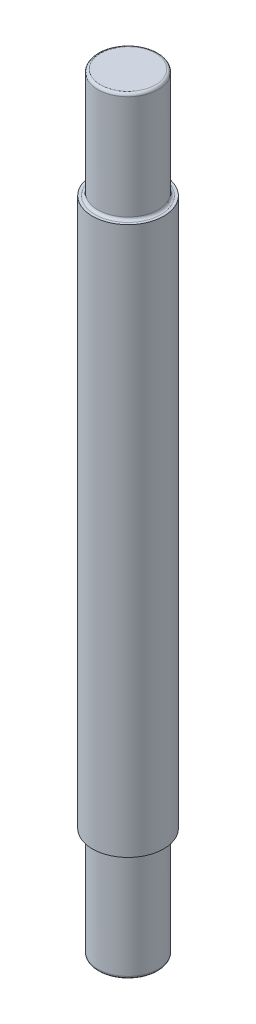
ISO-10303-21;
HEADER;
FILE_DESCRIPTION(('STEP AP214'),'2;1');
FILE_NAME('part.step','',(''),(''),'','','');
FILE_SCHEMA(('AUTOMOTIVE_DESIGN { 1 0 10303 214 1 1 1 1 }'));
ENDSEC;
DATA;
#1=APPLICATION_CONTEXT('core data for automotive mechanical design processes');
#2=APPLICATION_PROTOCOL_DEFINITION('international standard','automotive_design',2000,#1);
#3=PRODUCT_CONTEXT('',#1,'mechanical');
#4=PRODUCT('Part','Part','',(#3));
#5=PRODUCT_RELATED_PRODUCT_CATEGORY('part','',(#4));
#6=PRODUCT_DEFINITION_FORMATION('','',#4);
#7=PRODUCT_DEFINITION_CONTEXT('part definition',#1,'design');
#8=PRODUCT_DEFINITION('design','',#6,#7);
#9=PRODUCT_DEFINITION_SHAPE('','',#8);
#10=(LENGTH_UNIT() NAMED_UNIT(*) SI_UNIT(.MILLI.,.METRE.));
#11=(NAMED_UNIT(*) PLANE_ANGLE_UNIT() SI_UNIT($,.RADIAN.));
#12=(NAMED_UNIT(*) SI_UNIT($,.STERADIAN.) SOLID_ANGLE_UNIT());
#13=UNCERTAINTY_MEASURE_WITH_UNIT(LENGTH_MEASURE(1.E-05),#10,'distance_accuracy_value','');
#14=(GEOMETRIC_REPRESENTATION_CONTEXT(3) GLOBAL_UNCERTAINTY_ASSIGNED_CONTEXT((#13)) GLOBAL_UNIT_ASSIGNED_CONTEXT((#10,
#11,#12)) REPRESENTATION_CONTEXT('',''));
#15=CARTESIAN_POINT('',(0.,0.,0.));
#16=DIRECTION('',(0.,0.,1.));
#17=DIRECTION('',(1.,0.,0.));
#18=AXIS2_PLACEMENT_3D('',#15,#16,#17);
#19=CARTESIAN_POINT('',(0.,0.,0.));
#20=DIRECTION('',(0.,1.,0.));
#21=DIRECTION('',(-1.,0.,0.));
#22=AXIS2_PLACEMENT_3D('',#19,#20,#21);
#23=CYLINDRICAL_SURFACE('',#22,6.5);
#24=CARTESIAN_POINT('',(0.,100.,0.));
#25=DIRECTION('',(0.,1.,0.));
#26=DIRECTION('',(-1.,0.,0.));
#27=AXIS2_PLACEMENT_3D('',#24,#25,#26);
#28=CIRCLE('',#27,6.5);
#29=CARTESIAN_POINT('',(6.5,100.,0.));
#30=VERTEX_POINT('',#29);
#31=EDGE_CURVE('E20',#30,#30,#28,.T.);
#32=ORIENTED_EDGE('',*,*,#31,.F.);
#33=DIRECTION('',(0.,-1.,0.));
#34=VECTOR('',#33,1.);
#35=CARTESIAN_POINT('',(6.5,0.,0.));
#36=LINE('',#35,#34);
#37=CARTESIAN_POINT('',(6.5,0.,0.));
#38=VERTEX_POINT('',#37);
#39=EDGE_CURVE('E11',#30,#38,#36,.T.);
#40=ORIENTED_EDGE('',*,*,#39,.T.);
#41=CARTESIAN_POINT('',(0.,0.,0.));
#42=DIRECTION('',(0.,1.,0.));
#43=DIRECTION('',(-1.,0.,0.));
#44=AXIS2_PLACEMENT_3D('',#41,#42,#43);
#45=CIRCLE('',#44,6.5);
#46=EDGE_CURVE('E27',#38,#38,#45,.T.);
#47=ORIENTED_EDGE('',*,*,#46,.T.);
#48=ORIENTED_EDGE('',*,*,#39,.F.);
#49=EDGE_LOOP('',(#32,#40,#47,#48));
#50=FACE_BOUND('',#49,.T.);
#51=ADVANCED_FACE('F16',(#50),#23,.T.);
#52=CARTESIAN_POINT('',(0.,0.,0.));
#53=DIRECTION('',(0.,1.,0.));
#54=DIRECTION('',(1.,0.,0.));
#55=AXIS2_PLACEMENT_3D('',#52,#53,#54);
#56=PLANE('',#55);
#57=CARTESIAN_POINT('',(0.,0.,0.));
#58=DIRECTION('',(0.,-1.,0.));
#59=DIRECTION('',(-1.,0.,0.));
#60=AXIS2_PLACEMENT_3D('',#57,#58,#59);
#61=CIRCLE('',#60,6.);
#62=CARTESIAN_POINT('',(0.,0.,-6.));
#63=VERTEX_POINT('',#62);
#64=EDGE_CURVE('E106',#63,#63,#61,.T.);
#65=ORIENTED_EDGE('',*,*,#64,.F.);
#66=EDGE_LOOP('',(#65));
#67=FACE_BOUND('',#66,.T.);
#68=ORIENTED_EDGE('',*,*,#46,.F.);
#69=EDGE_LOOP('',(#68));
#70=FACE_BOUND('',#69,.T.);
#71=ADVANCED_FACE('F184',(#67,#70),#56,.F.);
#72=CARTESIAN_POINT('',(0.,-0.5,0.));
#73=DIRECTION('',(0.,1.,0.));
#74=DIRECTION('',(0.,0.,1.));
#75=AXIS2_PLACEMENT_3D('',#72,#73,#74);
#76=TOROIDAL_SURFACE('',#75,6.,0.5);
#77=CARTESIAN_POINT('',(0.,-0.5,0.));
#78=DIRECTION('',(0.,1.,0.));
#79=DIRECTION('',(-1.,0.,0.));
#80=AXIS2_PLACEMENT_3D('',#77,#78,#79);
#81=CIRCLE('',#80,5.5);
#82=CARTESIAN_POINT('',(-5.5,-0.5,0.));
#83=VERTEX_POINT('',#82);
#84=CARTESIAN_POINT('',(0.,-0.5,-5.5));
#85=VERTEX_POINT('',#84);
#86=EDGE_CURVE('E130',#83,#85,#81,.T.);
#87=ORIENTED_EDGE('',*,*,#86,.T.);
#88=CARTESIAN_POINT('',(0.,-0.5,-6.));
#89=DIRECTION('',(-1.,0.,0.));
#90=DIRECTION('',(0.,0.,-1.));
#91=AXIS2_PLACEMENT_3D('',#88,#89,#90);
#92=CIRCLE('',#91,0.5);
#93=EDGE_CURVE('E109',#85,#63,#92,.T.);
#94=ORIENTED_EDGE('',*,*,#93,.T.);
#95=ORIENTED_EDGE('',*,*,#64,.T.);
#96=ORIENTED_EDGE('',*,*,#93,.F.);
#97=CARTESIAN_POINT('',(0.,-0.5,0.));
#98=DIRECTION('',(0.,1.,0.));
#99=DIRECTION('',(-1.,0.,0.));
#100=AXIS2_PLACEMENT_3D('',#97,#98,#99);
#101=CIRCLE('',#100,5.5);
#102=EDGE_CURVE('E142',#85,#83,#101,.T.);
#103=ORIENTED_EDGE('',*,*,#102,.T.);
#104=EDGE_LOOP('',(#87,#94,#95,#96,#103));
#105=FACE_BOUND('',#104,.T.);
#106=ADVANCED_FACE('F165',(#105),#76,.F.);
#107=CARTESIAN_POINT('',(0.,-20.,0.));
#108=DIRECTION('',(0.,-1.,0.));
#109=DIRECTION('',(0.,0.,-1.));
#110=AXIS2_PLACEMENT_3D('',#107,#108,#109);
#111=PLANE('',#110);
#112=CARTESIAN_POINT('',(0.,-20.,0.));
#113=DIRECTION('',(0.,1.,0.));
#114=DIRECTION('',(-1.,0.,0.));
#115=AXIS2_PLACEMENT_3D('',#112,#113,#114);
#116=CIRCLE('',#115,5.);
#117=CARTESIAN_POINT('',(0.,-20.,5.));
#118=VERTEX_POINT('',#117);
#119=EDGE_CURVE('E100',#118,#118,#116,.T.);
#120=ORIENTED_EDGE('',*,*,#119,.F.);
#121=EDGE_LOOP('',(#120));
#122=FACE_BOUND('',#121,.T.);
#123=ADVANCED_FACE('F174',(#122),#111,.T.);
#124=CARTESIAN_POINT('',(0.,0.,0.));
#125=DIRECTION('',(0.,-1.,0.));
#126=DIRECTION('',(1.,0.,0.));
#127=AXIS2_PLACEMENT_3D('',#124,#125,#126);
#128=CYLINDRICAL_SURFACE('',#127,5.5);
#129=CARTESIAN_POINT('',(0.,-19.5,0.));
#130=DIRECTION('',(0.,-1.,0.));
#131=DIRECTION('',(-1.,0.,0.));
#132=AXIS2_PLACEMENT_3D('',#129,#130,#131);
#133=CIRCLE('',#132,5.5);
#134=CARTESIAN_POINT('',(-5.5,-19.5,0.));
#135=VERTEX_POINT('',#134);
#136=CARTESIAN_POINT('',(0.,-19.5,5.5));
#137=VERTEX_POINT('',#136);
#138=EDGE_CURVE('E119',#135,#137,#133,.T.);
#139=ORIENTED_EDGE('',*,*,#138,.F.);
#140=DIRECTION('',(0.,1.,0.));
#141=VECTOR('',#140,1.);
#142=CARTESIAN_POINT('',(-5.5,0.,0.));
#143=LINE('',#142,#141);
#144=EDGE_CURVE('E138',#135,#83,#143,.T.);
#145=ORIENTED_EDGE('',*,*,#144,.T.);
#146=ORIENTED_EDGE('',*,*,#102,.F.);
#147=ORIENTED_EDGE('',*,*,#86,.F.);
#148=ORIENTED_EDGE('',*,*,#144,.F.);
#149=CARTESIAN_POINT('',(0.,-19.5,0.));
#150=DIRECTION('',(0.,-1.,0.));
#151=DIRECTION('',(-1.,0.,0.));
#152=AXIS2_PLACEMENT_3D('',#149,#150,#151);
#153=CIRCLE('',#152,5.5);
#154=EDGE_CURVE('E115',#137,#135,#153,.T.);
#155=ORIENTED_EDGE('',*,*,#154,.F.);
#156=EDGE_LOOP('',(#139,#145,#146,#147,#148,#155));
#157=FACE_BOUND('',#156,.T.);
#158=ADVANCED_FACE('F168',(#157),#128,.T.);
#159=CARTESIAN_POINT('',(0.,-19.5,0.));
#160=DIRECTION('',(0.,-1.,0.));
#161=DIRECTION('',(0.,0.,-1.));
#162=AXIS2_PLACEMENT_3D('',#159,#160,#161);
#163=TOROIDAL_SURFACE('',#162,5.,0.5);
#164=ORIENTED_EDGE('',*,*,#119,.T.);
#165=CARTESIAN_POINT('',(0.,-19.5,5.));
#166=DIRECTION('',(-1.,0.,0.));
#167=DIRECTION('',(0.,0.,1.));
#168=AXIS2_PLACEMENT_3D('',#165,#166,#167);
#169=CIRCLE('',#168,0.5);
#170=EDGE_CURVE('E120',#118,#137,#169,.T.);
#171=ORIENTED_EDGE('',*,*,#170,.T.);
#172=ORIENTED_EDGE('',*,*,#154,.T.);
#173=ORIENTED_EDGE('',*,*,#138,.T.);
#174=ORIENTED_EDGE('',*,*,#170,.F.);
#175=EDGE_LOOP('',(#164,#171,#172,#173,#174));
#176=FACE_BOUND('',#175,.T.);
#177=ADVANCED_FACE('F171',(#176),#163,.T.);
#178=CARTESIAN_POINT('',(0.,100.,0.));
#179=DIRECTION('',(0.,1.,0.));
#180=DIRECTION('',(1.,0.,0.));
#181=AXIS2_PLACEMENT_3D('',#178,#179,#180);
#182=PLANE('',#181);
#183=CARTESIAN_POINT('',(0.,100.,0.));
#184=DIRECTION('',(0.,1.,0.));
#185=DIRECTION('',(-1.,0.,0.));
#186=AXIS2_PLACEMENT_3D('',#183,#184,#185);
#187=CIRCLE('',#186,6.);
#188=CARTESIAN_POINT('',(0.,100.,6.));
#189=VERTEX_POINT('',#188);
#190=EDGE_CURVE('E86',#189,#189,#187,.T.);
#191=ORIENTED_EDGE('',*,*,#190,.F.);
#192=EDGE_LOOP('',(#191));
#193=FACE_BOUND('',#192,.T.);
#194=ORIENTED_EDGE('',*,*,#31,.T.);
#195=EDGE_LOOP('',(#194));
#196=FACE_BOUND('',#195,.T.);
#197=ADVANCED_FACE('F196',(#193,#196),#182,.T.);
#198=CARTESIAN_POINT('',(0.,100.5,0.));
#199=DIRECTION('',(0.,-1.,0.));
#200=DIRECTION('',(0.,0.,-1.));
#201=AXIS2_PLACEMENT_3D('',#198,#199,#200);
#202=TOROIDAL_SURFACE('',#201,6.,0.5);
#203=CARTESIAN_POINT('',(0.,100.5,0.));
#204=DIRECTION('',(0.,-1.,0.));
#205=DIRECTION('',(-1.,0.,0.));
#206=AXIS2_PLACEMENT_3D('',#203,#204,#205);
#207=CIRCLE('',#206,5.5);
#208=CARTESIAN_POINT('',(-5.5,100.5,0.));
#209=VERTEX_POINT('',#208);
#210=CARTESIAN_POINT('',(0.,100.5,5.5));
#211=VERTEX_POINT('',#210);
#212=EDGE_CURVE('E101',#209,#211,#207,.T.);
#213=ORIENTED_EDGE('',*,*,#212,.T.);
#214=CARTESIAN_POINT('',(0.,100.5,6.));
#215=DIRECTION('',(-1.,0.,0.));
#216=DIRECTION('',(0.,0.,1.));
#217=AXIS2_PLACEMENT_3D('',#214,#215,#216);
#218=CIRCLE('',#217,0.5);
#219=EDGE_CURVE('E90',#211,#189,#218,.T.);
#220=ORIENTED_EDGE('',*,*,#219,.T.);
#221=ORIENTED_EDGE('',*,*,#190,.T.);
#222=ORIENTED_EDGE('',*,*,#219,.F.);
#223=CARTESIAN_POINT('',(0.,100.5,0.));
#224=DIRECTION('',(0.,-1.,0.));
#225=DIRECTION('',(-1.,0.,0.));
#226=AXIS2_PLACEMENT_3D('',#223,#224,#225);
#227=CIRCLE('',#226,5.5);
#228=EDGE_CURVE('E105',#211,#209,#227,.T.);
#229=ORIENTED_EDGE('',*,*,#228,.T.);
#230=EDGE_LOOP('',(#213,#220,#221,#222,#229));
#231=FACE_BOUND('',#230,.T.);
#232=ADVANCED_FACE('F88',(#231),#202,.F.);
#233=CARTESIAN_POINT('',(0.,120.,0.));
#234=DIRECTION('',(0.,1.,0.));
#235=DIRECTION('',(1.,0.,0.));
#236=AXIS2_PLACEMENT_3D('',#233,#234,#235);
#237=PLANE('',#236);
#238=CARTESIAN_POINT('',(0.,120.,0.));
#239=DIRECTION('',(0.,-1.,0.));
#240=DIRECTION('',(-1.,0.,0.));
#241=AXIS2_PLACEMENT_3D('',#238,#239,#240);
#242=CIRCLE('',#241,5.);
#243=CARTESIAN_POINT('',(0.,120.,-5.));
#244=VERTEX_POINT('',#243);
#245=EDGE_CURVE('E133',#244,#244,#242,.T.);
#246=ORIENTED_EDGE('',*,*,#245,.F.);
#247=EDGE_LOOP('',(#246));
#248=FACE_BOUND('',#247,.T.);
#249=ADVANCED_FACE('F18',(#248),#237,.T.);
#250=CARTESIAN_POINT('',(0.,100.,0.));
#251=DIRECTION('',(0.,1.,0.));
#252=DIRECTION('',(1.,0.,0.));
#253=AXIS2_PLACEMENT_3D('',#250,#251,#252);
#254=CYLINDRICAL_SURFACE('',#253,5.5);
#255=CARTESIAN_POINT('',(0.,119.5,0.));
#256=DIRECTION('',(0.,1.,0.));
#257=DIRECTION('',(-1.,0.,0.));
#258=AXIS2_PLACEMENT_3D('',#255,#256,#257);
#259=CIRCLE('',#258,5.5);
#260=CARTESIAN_POINT('',(-5.5,119.5,0.));
#261=VERTEX_POINT('',#260);
#262=CARTESIAN_POINT('',(0.,119.5,-5.5));
#263=VERTEX_POINT('',#262);
#264=EDGE_CURVE('E113',#261,#263,#259,.T.);
#265=ORIENTED_EDGE('',*,*,#264,.F.);
#266=DIRECTION('',(0.,-1.,0.));
#267=VECTOR('',#266,1.);
#268=CARTESIAN_POINT('',(-5.5,100.,0.));
#269=LINE('',#268,#267);
#270=EDGE_CURVE('E110',#261,#209,#269,.T.);
#271=ORIENTED_EDGE('',*,*,#270,.T.);
#272=ORIENTED_EDGE('',*,*,#228,.F.);
#273=ORIENTED_EDGE('',*,*,#212,.F.);
#274=ORIENTED_EDGE('',*,*,#270,.F.);
#275=CARTESIAN_POINT('',(0.,119.5,0.));
#276=DIRECTION('',(0.,1.,0.));
#277=DIRECTION('',(-1.,0.,0.));
#278=AXIS2_PLACEMENT_3D('',#275,#276,#277);
#279=CIRCLE('',#278,5.5);
#280=EDGE_CURVE('E124',#263,#261,#279,.T.);
#281=ORIENTED_EDGE('',*,*,#280,.F.);
#282=EDGE_LOOP('',(#265,#271,#272,#273,#274,#281));
#283=FACE_BOUND('',#282,.T.);
#284=ADVANCED_FACE('F208',(#283),#254,.T.);
#285=CARTESIAN_POINT('',(0.,119.5,0.));
#286=DIRECTION('',(0.,1.,0.));
#287=DIRECTION('',(0.,0.,1.));
#288=AXIS2_PLACEMENT_3D('',#285,#286,#287);
#289=TOROIDAL_SURFACE('',#288,5.,0.5);
#290=ORIENTED_EDGE('',*,*,#245,.T.);
#291=CARTESIAN_POINT('',(0.,119.5,-5.));
#292=DIRECTION('',(-1.,0.,0.));
#293=DIRECTION('',(0.,0.,-1.));
#294=AXIS2_PLACEMENT_3D('',#291,#292,#293);
#295=CIRCLE('',#294,0.5);
#296=EDGE_CURVE('E137',#244,#263,#295,.T.);
#297=ORIENTED_EDGE('',*,*,#296,.T.);
#298=ORIENTED_EDGE('',*,*,#280,.T.);
#299=ORIENTED_EDGE('',*,*,#264,.T.);
#300=ORIENTED_EDGE('',*,*,#296,.F.);
#301=EDGE_LOOP('',(#290,#297,#298,#299,#300));
#302=FACE_BOUND('',#301,.T.);
#303=ADVANCED_FACE('F211',(#302),#289,.T.);
#304=CLOSED_SHELL('',(#51,#71,#106,#123,#158,#177,#197,#232,#249,#284,#303));
#305=MANIFOLD_SOLID_BREP('B1',#304);
#306=ADVANCED_BREP_SHAPE_REPRESENTATION('',(#18,#305),#14);
#307=SHAPE_DEFINITION_REPRESENTATION(#9,#306);
ENDSEC;
END-ISO-10303-21;
